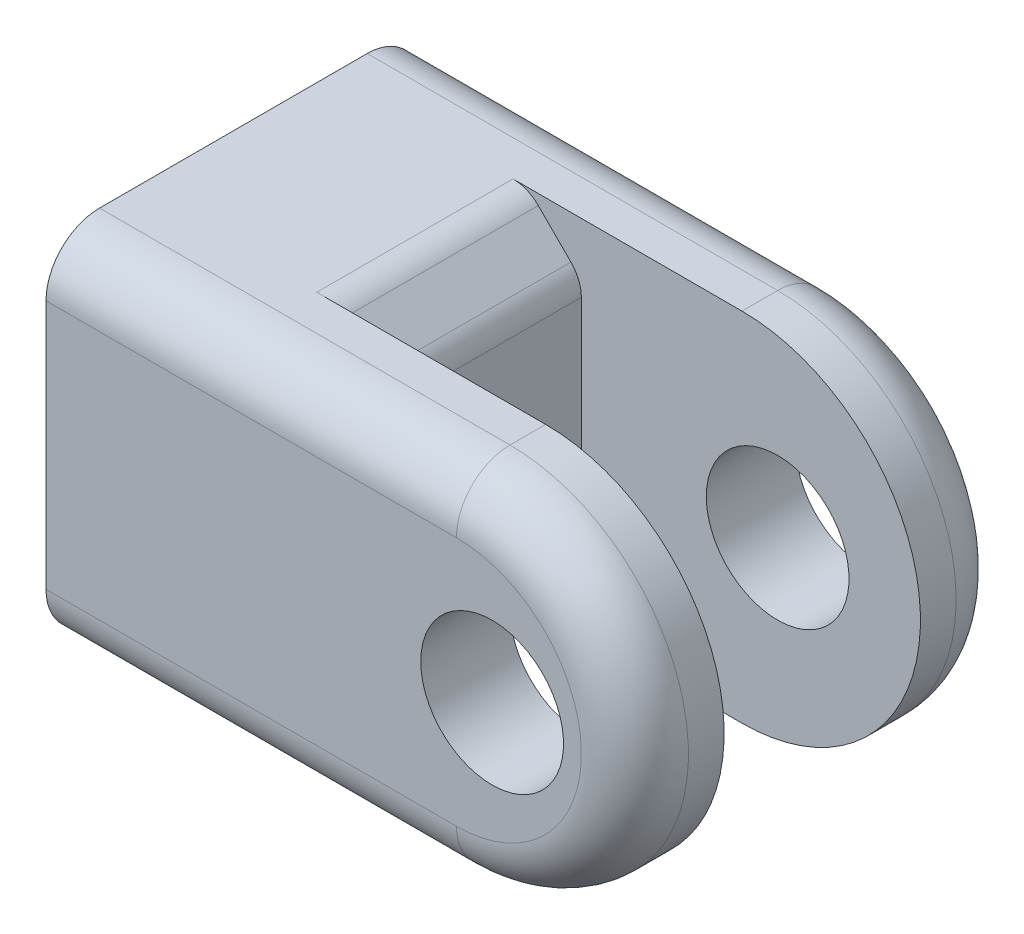
ISO-10303-21;
HEADER;
FILE_DESCRIPTION(('STEP AP214'),'2;1');
FILE_NAME('part.step','',(''),(''),'','','');
FILE_SCHEMA(('AUTOMOTIVE_DESIGN { 1 0 10303 214 1 1 1 1 }'));
ENDSEC;
DATA;
#1=APPLICATION_CONTEXT('core data for automotive mechanical design processes');
#2=APPLICATION_PROTOCOL_DEFINITION('international standard','automotive_design',2000,#1);
#3=PRODUCT_CONTEXT('',#1,'mechanical');
#4=PRODUCT('Part','Part','',(#3));
#5=PRODUCT_RELATED_PRODUCT_CATEGORY('part','',(#4));
#6=PRODUCT_DEFINITION_FORMATION('','',#4);
#7=PRODUCT_DEFINITION_CONTEXT('part definition',#1,'design');
#8=PRODUCT_DEFINITION('design','',#6,#7);
#9=PRODUCT_DEFINITION_SHAPE('','',#8);
#10=(LENGTH_UNIT() NAMED_UNIT(*) SI_UNIT(.MILLI.,.METRE.));
#11=(NAMED_UNIT(*) PLANE_ANGLE_UNIT() SI_UNIT($,.RADIAN.));
#12=(NAMED_UNIT(*) SI_UNIT($,.STERADIAN.) SOLID_ANGLE_UNIT());
#13=UNCERTAINTY_MEASURE_WITH_UNIT(LENGTH_MEASURE(1.E-05),#10,'distance_accuracy_value','');
#14=(GEOMETRIC_REPRESENTATION_CONTEXT(3) GLOBAL_UNCERTAINTY_ASSIGNED_CONTEXT((#13)) GLOBAL_UNIT_ASSIGNED_CONTEXT((#10,
#11,#12)) REPRESENTATION_CONTEXT('',''));
#15=CARTESIAN_POINT('',(0.,0.,0.));
#16=DIRECTION('',(0.,0.,1.));
#17=DIRECTION('',(1.,0.,0.));
#18=AXIS2_PLACEMENT_3D('',#15,#16,#17);
#19=CARTESIAN_POINT('',(23.,10.,21.));
#20=DIRECTION('',(0.,0.,-1.));
#21=DIRECTION('',(-1.,0.,0.));
#22=AXIS2_PLACEMENT_3D('',#19,#20,#21);
#23=CYLINDRICAL_SURFACE('',#22,9.99999999999999);
#24=DIRECTION('',(0.,0.,-1.));
#25=VECTOR('',#24,1.);
#26=CARTESIAN_POINT('',(23.,20.,21.));
#27=LINE('',#26,#25);
#28=CARTESIAN_POINT('',(23.,20.,18.));
#29=VERTEX_POINT('',#28);
#30=CARTESIAN_POINT('',(23.,20.,16.));
#31=VERTEX_POINT('',#30);
#32=EDGE_CURVE('E254',#29,#31,#27,.T.);
#33=ORIENTED_EDGE('',*,*,#32,.F.);
#34=CARTESIAN_POINT('',(23.,10.,18.));
#35=DIRECTION('',(0.,0.,-1.));
#36=DIRECTION('',(-1.,0.,0.));
#37=AXIS2_PLACEMENT_3D('',#34,#35,#36);
#38=CIRCLE('',#37,9.99999999999999);
#39=CARTESIAN_POINT('',(23.,0.,18.));
#40=VERTEX_POINT('',#39);
#41=EDGE_CURVE('E283',#29,#40,#38,.T.);
#42=ORIENTED_EDGE('',*,*,#41,.T.);
#43=DIRECTION('',(0.,0.,-1.));
#44=VECTOR('',#43,1.);
#45=CARTESIAN_POINT('',(23.,0.,21.));
#46=LINE('',#45,#44);
#47=CARTESIAN_POINT('',(23.,0.,16.));
#48=VERTEX_POINT('',#47);
#49=EDGE_CURVE('E257',#40,#48,#46,.T.);
#50=ORIENTED_EDGE('',*,*,#49,.T.);
#51=CARTESIAN_POINT('',(23.,10.,16.));
#52=DIRECTION('',(0.,0.,1.));
#53=DIRECTION('',(1.,0.,0.));
#54=AXIS2_PLACEMENT_3D('',#51,#52,#53);
#55=CIRCLE('',#54,9.99999999999999);
#56=EDGE_CURVE('E232',#48,#31,#55,.T.);
#57=ORIENTED_EDGE('',*,*,#56,.T.);
#58=EDGE_LOOP('',(#33,#42,#50,#57));
#59=FACE_BOUND('',#58,.T.);
#60=ADVANCED_FACE('F38',(#59),#23,.T.);
#61=CARTESIAN_POINT('',(25.,10.,21.));
#62=DIRECTION('',(0.,0.,-1.));
#63=DIRECTION('',(-1.,0.,0.));
#64=AXIS2_PLACEMENT_3D('',#61,#62,#63);
#65=CYLINDRICAL_SURFACE('',#64,4.);
#66=CARTESIAN_POINT('',(25.,10.,16.));
#67=DIRECTION('',(0.,0.,1.));
#68=DIRECTION('',(1.,0.,0.));
#69=AXIS2_PLACEMENT_3D('',#66,#67,#68);
#70=CIRCLE('',#69,4.);
#71=CARTESIAN_POINT('',(21.,10.,16.));
#72=VERTEX_POINT('',#71);
#73=EDGE_CURVE('E231',#72,#72,#70,.T.);
#74=CARTESIAN_POINT('',(25.,10.,21.));
#75=DIRECTION('',(0.,0.,1.));
#76=DIRECTION('',(1.,0.,0.));
#77=AXIS2_PLACEMENT_3D('',#74,#75,#76);
#78=CIRCLE('',#77,4.);
#79=CARTESIAN_POINT('',(21.,10.,21.));
#80=VERTEX_POINT('',#79);
#81=EDGE_CURVE('E236',#80,#80,#78,.T.);
#82=CARTESIAN_POINT('',(21.,10.,16.));
#83=CARTESIAN_POINT('',(21.,10.,16.0520833333333));
#84=CARTESIAN_POINT('',(21.,10.,16.1041666666667));
#85=CARTESIAN_POINT('',(21.,10.,16.2083333333333));
#86=CARTESIAN_POINT('',(21.,10.,16.2604166666667));
#87=CARTESIAN_POINT('',(21.,10.,16.3645833333333));
#88=CARTESIAN_POINT('',(21.,10.,16.4166666666667));
#89=CARTESIAN_POINT('',(21.,10.,16.5208333333333));
#90=CARTESIAN_POINT('',(21.,10.,16.5729166666667));
#91=CARTESIAN_POINT('',(21.,10.,16.6770833333333));
#92=CARTESIAN_POINT('',(21.,10.,16.7291666666667));
#93=CARTESIAN_POINT('',(21.,10.,16.8333333333333));
#94=CARTESIAN_POINT('',(21.,10.,16.8854166666667));
#95=CARTESIAN_POINT('',(21.,10.,16.9895833333333));
#96=CARTESIAN_POINT('',(21.,10.,17.0416666666667));
#97=CARTESIAN_POINT('',(21.,10.,17.1458333333333));
#98=CARTESIAN_POINT('',(21.,10.,17.1979166666667));
#99=CARTESIAN_POINT('',(21.,10.,17.3020833333333));
#100=CARTESIAN_POINT('',(21.,10.,17.3541666666667));
#101=CARTESIAN_POINT('',(21.,10.,17.4583333333333));
#102=CARTESIAN_POINT('',(21.,10.,17.5104166666667));
#103=CARTESIAN_POINT('',(21.,10.,17.6145833333333));
#104=CARTESIAN_POINT('',(21.,10.,17.6666666666667));
#105=CARTESIAN_POINT('',(21.,10.,17.7708333333333));
#106=CARTESIAN_POINT('',(21.,10.,17.8229166666667));
#107=CARTESIAN_POINT('',(21.,10.,17.9270833333333));
#108=CARTESIAN_POINT('',(21.,10.,17.9791666666667));
#109=CARTESIAN_POINT('',(21.,10.,18.0833333333333));
#110=CARTESIAN_POINT('',(21.,10.,18.1354166666667));
#111=CARTESIAN_POINT('',(21.,10.,18.2395833333333));
#112=CARTESIAN_POINT('',(21.,10.,18.2916666666667));
#113=CARTESIAN_POINT('',(21.,10.,18.3958333333333));
#114=CARTESIAN_POINT('',(21.,10.,18.4479166666667));
#115=CARTESIAN_POINT('',(21.,10.,18.5520833333333));
#116=CARTESIAN_POINT('',(21.,10.,18.6041666666667));
#117=CARTESIAN_POINT('',(21.,10.,18.7083333333333));
#118=CARTESIAN_POINT('',(21.,10.,18.7604166666667));
#119=CARTESIAN_POINT('',(21.,10.,18.8645833333333));
#120=CARTESIAN_POINT('',(21.,10.,18.9166666666667));
#121=CARTESIAN_POINT('',(21.,10.,19.0208333333333));
#122=CARTESIAN_POINT('',(21.,10.,19.0729166666667));
#123=CARTESIAN_POINT('',(21.,10.,19.1770833333333));
#124=CARTESIAN_POINT('',(21.,10.,19.2291666666667));
#125=CARTESIAN_POINT('',(21.,10.,19.3333333333333));
#126=CARTESIAN_POINT('',(21.,10.,19.3854166666667));
#127=CARTESIAN_POINT('',(21.,10.,19.4895833333333));
#128=CARTESIAN_POINT('',(21.,10.,19.5416666666667));
#129=CARTESIAN_POINT('',(21.,10.,19.6458333333333));
#130=CARTESIAN_POINT('',(21.,10.,19.6979166666667));
#131=CARTESIAN_POINT('',(21.,10.,19.8020833333333));
#132=CARTESIAN_POINT('',(21.,10.,19.8541666666667));
#133=CARTESIAN_POINT('',(21.,10.,19.9583333333333));
#134=CARTESIAN_POINT('',(21.,10.,20.0104166666667));
#135=CARTESIAN_POINT('',(21.,10.,20.1145833333333));
#136=CARTESIAN_POINT('',(21.,10.,20.1666666666667));
#137=CARTESIAN_POINT('',(21.,10.,20.2708333333333));
#138=CARTESIAN_POINT('',(21.,10.,20.3229166666667));
#139=CARTESIAN_POINT('',(21.,10.,20.4270833333333));
#140=CARTESIAN_POINT('',(21.,10.,20.4791666666667));
#141=CARTESIAN_POINT('',(21.,10.,20.5833333333333));
#142=CARTESIAN_POINT('',(21.,10.,20.6354166666667));
#143=CARTESIAN_POINT('',(21.,10.,20.7395833333333));
#144=CARTESIAN_POINT('',(21.,10.,20.7916666666667));
#145=CARTESIAN_POINT('',(21.,10.,20.8958333333333));
#146=CARTESIAN_POINT('',(21.,10.,20.9479166666667));
#147=CARTESIAN_POINT('',(21.,10.,21.));
#148=B_SPLINE_CURVE_WITH_KNOTS('',3,(#82,#83,#84,#85,#86,#87,#88,#89,#90,#91,#92,#93,#94,#95,
#96,#97,#98,#99,#100,#101,#102,#103,#104,#105,#106,#107,#108,#109,#110,#111,#112,#113,#114,#115,
#116,#117,#118,#119,#120,#121,#122,#123,#124,#125,#126,#127,#128,#129,#130,#131,#132,#133,#134,
#135,#136,#137,#138,#139,#140,#141,#142,#143,#144,#145,#146,#147),.UNSPECIFIED.,.F.,.F.,(4,2,2,
2,2,2,2,2,2,2,2,2,2,2,2,2,2,2,2,2,2,2,2,2,2,2,2,2,2,2,2,2,4),(0.,0.15625,0.3125,0.46875,
0.625000000000001,0.781250000000001,0.937500000000001,1.09375,1.25,1.40625,1.5625,1.71875,1.875,
2.03125,2.1875,2.34375,2.5,2.65625,2.8125,2.96875,3.125,3.28125,3.4375,3.59375,3.75,3.90625,
4.0625,4.21875,4.375,4.53125,4.6875,4.84375,5.),.UNSPECIFIED.);
#149=EDGE_CURVE('BSEAM448',#72,#80,#148,.T.);
#150=ORIENTED_EDGE('',*,*,#73,.F.);
#151=ORIENTED_EDGE('',*,*,#81,.T.);
#152=ORIENTED_EDGE('',*,*,#149,.T.);
#153=ORIENTED_EDGE('',*,*,#149,.F.);
#154=EDGE_LOOP('',(#150,#152,#151,#153));
#155=FACE_BOUND('',#154,.T.);
#156=ADVANCED_FACE('F448',(#155),#65,.F.);
#157=CARTESIAN_POINT('',(23.,10.,21.));
#158=DIRECTION('',(0.,0.,-1.));
#159=DIRECTION('',(-1.,0.,0.));
#160=AXIS2_PLACEMENT_3D('',#157,#158,#159);
#161=PLANE('',#160);
#162=CARTESIAN_POINT('',(23.,10.,21.));
#163=DIRECTION('',(0.,0.,-1.));
#164=DIRECTION('',(-1.,0.,0.));
#165=AXIS2_PLACEMENT_3D('',#162,#163,#164);
#166=CIRCLE('',#165,6.99999999999999);
#167=CARTESIAN_POINT('',(23.,3.,21.));
#168=VERTEX_POINT('',#167);
#169=CARTESIAN_POINT('',(23.,17.,21.));
#170=VERTEX_POINT('',#169);
#171=EDGE_CURVE('E265',#168,#170,#166,.F.);
#172=ORIENTED_EDGE('',*,*,#171,.T.);
#173=DIRECTION('',(-1.,0.,0.));
#174=VECTOR('',#173,1.);
#175=CARTESIAN_POINT('',(23.,17.,21.));
#176=LINE('',#175,#174);
#177=CARTESIAN_POINT('',(0.,17.,21.));
#178=VERTEX_POINT('',#177);
#179=EDGE_CURVE('E267',#170,#178,#176,.T.);
#180=ORIENTED_EDGE('',*,*,#179,.T.);
#181=DIRECTION('',(0.,-1.,0.));
#182=VECTOR('',#181,1.);
#183=CARTESIAN_POINT('',(0.,0.,21.));
#184=LINE('',#183,#182);
#185=CARTESIAN_POINT('',(0.,3.,21.));
#186=VERTEX_POINT('',#185);
#187=EDGE_CURVE('E242',#178,#186,#184,.T.);
#188=ORIENTED_EDGE('',*,*,#187,.T.);
#189=DIRECTION('',(1.,0.,0.));
#190=VECTOR('',#189,1.);
#191=CARTESIAN_POINT('',(23.,3.,21.));
#192=LINE('',#191,#190);
#193=EDGE_CURVE('E259',#186,#168,#192,.T.);
#194=ORIENTED_EDGE('',*,*,#193,.T.);
#195=EDGE_LOOP('',(#172,#180,#188,#194));
#196=FACE_BOUND('',#195,.T.);
#197=ORIENTED_EDGE('',*,*,#81,.F.);
#198=EDGE_LOOP('',(#197));
#199=FACE_BOUND('',#198,.T.);
#200=ADVANCED_FACE('F409',(#196,#199),#161,.F.);
#201=CARTESIAN_POINT('',(23.,10.,0.));
#202=DIRECTION('',(0.,0.,-1.));
#203=DIRECTION('',(-1.,0.,0.));
#204=AXIS2_PLACEMENT_3D('',#201,#202,#203);
#205=PLANE('',#204);
#206=DIRECTION('',(0.,-1.,0.));
#207=VECTOR('',#206,1.);
#208=CARTESIAN_POINT('',(0.,0.,0.));
#209=LINE('',#208,#207);
#210=CARTESIAN_POINT('',(0.,17.,0.));
#211=VERTEX_POINT('',#210);
#212=CARTESIAN_POINT('',(0.,3.,0.));
#213=VERTEX_POINT('',#212);
#214=EDGE_CURVE('E239',#211,#213,#209,.T.);
#215=ORIENTED_EDGE('',*,*,#214,.F.);
#216=DIRECTION('',(-1.,0.,0.));
#217=VECTOR('',#216,1.);
#218=CARTESIAN_POINT('',(23.,17.,0.));
#219=LINE('',#218,#217);
#220=CARTESIAN_POINT('',(23.,17.,0.));
#221=VERTEX_POINT('',#220);
#222=EDGE_CURVE('E289',#211,#221,#219,.F.);
#223=ORIENTED_EDGE('',*,*,#222,.T.);
#224=CARTESIAN_POINT('',(23.,10.,0.));
#225=DIRECTION('',(0.,0.,-1.));
#226=DIRECTION('',(-1.,0.,0.));
#227=AXIS2_PLACEMENT_3D('',#224,#225,#226);
#228=CIRCLE('',#227,6.99999999999999);
#229=CARTESIAN_POINT('',(23.,3.,0.));
#230=VERTEX_POINT('',#229);
#231=EDGE_CURVE('E287',#221,#230,#228,.T.);
#232=ORIENTED_EDGE('',*,*,#231,.T.);
#233=DIRECTION('',(1.,0.,0.));
#234=VECTOR('',#233,1.);
#235=CARTESIAN_POINT('',(0.,3.,0.));
#236=LINE('',#235,#234);
#237=EDGE_CURVE('E285',#230,#213,#236,.F.);
#238=ORIENTED_EDGE('',*,*,#237,.T.);
#239=EDGE_LOOP('',(#215,#223,#232,#238));
#240=FACE_BOUND('',#239,.T.);
#241=CARTESIAN_POINT('',(25.,10.,0.));
#242=DIRECTION('',(0.,0.,1.));
#243=DIRECTION('',(1.,0.,0.));
#244=AXIS2_PLACEMENT_3D('',#241,#242,#243);
#245=CIRCLE('',#244,4.);
#246=CARTESIAN_POINT('',(21.,10.,0.));
#247=VERTEX_POINT('',#246);
#248=EDGE_CURVE('E235',#247,#247,#245,.T.);
#249=ORIENTED_EDGE('',*,*,#248,.T.);
#250=EDGE_LOOP('',(#249));
#251=FACE_BOUND('',#250,.T.);
#252=ADVANCED_FACE('F435',(#240,#251),#205,.T.);
#253=CARTESIAN_POINT('',(0.,0.,21.));
#254=DIRECTION('',(0.,1.,0.));
#255=DIRECTION('',(0.,0.,1.));
#256=AXIS2_PLACEMENT_3D('',#253,#254,#255);
#257=PLANE('',#256);
#258=DIRECTION('',(0.,0.,-1.));
#259=VECTOR('',#258,1.);
#260=CARTESIAN_POINT('',(10.1715728752538,0.,16.));
#261=LINE('',#260,#259);
#262=CARTESIAN_POINT('',(10.1715728752538,0.,5.));
#263=VERTEX_POINT('',#262);
#264=CARTESIAN_POINT('',(10.1715728752538,0.,16.));
#265=VERTEX_POINT('',#264);
#266=EDGE_CURVE('E337',#263,#265,#261,.F.);
#267=ORIENTED_EDGE('',*,*,#266,.T.);
#268=DIRECTION('',(-1.,0.,0.));
#269=VECTOR('',#268,1.);
#270=CARTESIAN_POINT('',(14.,0.,16.));
#271=LINE('',#270,#269);
#272=EDGE_CURVE('E53',#48,#265,#271,.T.);
#273=ORIENTED_EDGE('',*,*,#272,.F.);
#274=ORIENTED_EDGE('',*,*,#49,.F.);
#275=DIRECTION('',(1.,0.,0.));
#276=VECTOR('',#275,1.);
#277=CARTESIAN_POINT('',(0.,0.,18.));
#278=LINE('',#277,#276);
#279=CARTESIAN_POINT('',(0.,0.,18.));
#280=VERTEX_POINT('',#279);
#281=EDGE_CURVE('E295',#40,#280,#278,.F.);
#282=ORIENTED_EDGE('',*,*,#281,.T.);
#283=DIRECTION('',(0.,0.,-1.));
#284=VECTOR('',#283,1.);
#285=CARTESIAN_POINT('',(0.,0.,21.));
#286=LINE('',#285,#284);
#287=CARTESIAN_POINT('',(0.,0.,3.00000000000001));
#288=VERTEX_POINT('',#287);
#289=EDGE_CURVE('E245',#280,#288,#286,.T.);
#290=ORIENTED_EDGE('',*,*,#289,.T.);
#291=DIRECTION('',(1.,0.,0.));
#292=VECTOR('',#291,1.);
#293=CARTESIAN_POINT('',(23.,0.,3.));
#294=LINE('',#293,#292);
#295=CARTESIAN_POINT('',(23.,0.,3.00000000000001));
#296=VERTEX_POINT('',#295);
#297=EDGE_CURVE('E293',#288,#296,#294,.T.);
#298=ORIENTED_EDGE('',*,*,#297,.T.);
#299=CARTESIAN_POINT('',(23.,0.,5.));
#300=VERTEX_POINT('',#299);
#301=EDGE_CURVE('E256',#300,#296,#46,.T.);
#302=ORIENTED_EDGE('',*,*,#301,.F.);
#303=DIRECTION('',(1.,0.,0.));
#304=VECTOR('',#303,1.);
#305=CARTESIAN_POINT('',(14.,0.,5.));
#306=LINE('',#305,#304);
#307=EDGE_CURVE('E61',#263,#300,#306,.T.);
#308=ORIENTED_EDGE('',*,*,#307,.F.);
#309=EDGE_LOOP('',(#267,#273,#274,#282,#290,#298,#302,#308));
#310=FACE_BOUND('',#309,.T.);
#311=ADVANCED_FACE('F396',(#310),#257,.F.);
#312=ORIENTED_EDGE('',*,*,#301,.T.);
#313=CARTESIAN_POINT('',(23.,10.,3.));
#314=DIRECTION('',(0.,0.,-1.));
#315=DIRECTION('',(-1.,0.,0.));
#316=AXIS2_PLACEMENT_3D('',#313,#314,#315);
#317=CIRCLE('',#316,9.99999999999999);
#318=CARTESIAN_POINT('',(23.,20.,3.));
#319=VERTEX_POINT('',#318);
#320=EDGE_CURVE('E291',#296,#319,#317,.F.);
#321=ORIENTED_EDGE('',*,*,#320,.T.);
#322=CARTESIAN_POINT('',(23.,20.,5.00000000000001));
#323=VERTEX_POINT('',#322);
#324=EDGE_CURVE('E253',#323,#319,#27,.T.);
#325=ORIENTED_EDGE('',*,*,#324,.F.);
#326=CARTESIAN_POINT('',(23.,10.,5.));
#327=DIRECTION('',(0.,0.,-1.));
#328=DIRECTION('',(-1.,0.,0.));
#329=AXIS2_PLACEMENT_3D('',#326,#327,#328);
#330=CIRCLE('',#329,9.99999999999999);
#331=EDGE_CURVE('E229',#323,#300,#330,.T.);
#332=ORIENTED_EDGE('',*,*,#331,.T.);
#333=EDGE_LOOP('',(#312,#321,#325,#332));
#334=FACE_BOUND('',#333,.T.);
#335=ADVANCED_FACE('F430',(#334),#23,.T.);
#336=CARTESIAN_POINT('',(0.,20.,21.));
#337=DIRECTION('',(0.,-1.,0.));
#338=DIRECTION('',(1.,0.,0.));
#339=AXIS2_PLACEMENT_3D('',#336,#337,#338);
#340=PLANE('',#339);
#341=DIRECTION('',(0.,0.,1.));
#342=VECTOR('',#341,1.);
#343=CARTESIAN_POINT('',(10.1715728752538,20.,5.));
#344=LINE('',#343,#342);
#345=CARTESIAN_POINT('',(10.1715728752538,20.,16.));
#346=VERTEX_POINT('',#345);
#347=CARTESIAN_POINT('',(10.1715728752538,20.,5.));
#348=VERTEX_POINT('',#347);
#349=EDGE_CURVE('E320',#346,#348,#344,.F.);
#350=ORIENTED_EDGE('',*,*,#349,.T.);
#351=DIRECTION('',(-1.,0.,0.));
#352=VECTOR('',#351,1.);
#353=CARTESIAN_POINT('',(14.,20.,5.));
#354=LINE('',#353,#352);
#355=EDGE_CURVE('E215',#323,#348,#354,.T.);
#356=ORIENTED_EDGE('',*,*,#355,.F.);
#357=ORIENTED_EDGE('',*,*,#324,.T.);
#358=DIRECTION('',(-1.,0.,0.));
#359=VECTOR('',#358,1.);
#360=CARTESIAN_POINT('',(0.,20.,3.));
#361=LINE('',#360,#359);
#362=CARTESIAN_POINT('',(0.,20.,3.00000000000001));
#363=VERTEX_POINT('',#362);
#364=EDGE_CURVE('E278',#319,#363,#361,.T.);
#365=ORIENTED_EDGE('',*,*,#364,.T.);
#366=DIRECTION('',(0.,0.,-1.));
#367=VECTOR('',#366,1.);
#368=CARTESIAN_POINT('',(0.,20.,21.));
#369=LINE('',#368,#367);
#370=CARTESIAN_POINT('',(0.,20.,18.));
#371=VERTEX_POINT('',#370);
#372=EDGE_CURVE('E250',#371,#363,#369,.T.);
#373=ORIENTED_EDGE('',*,*,#372,.F.);
#374=DIRECTION('',(-1.,0.,0.));
#375=VECTOR('',#374,1.);
#376=CARTESIAN_POINT('',(0.,20.,18.));
#377=LINE('',#376,#375);
#378=EDGE_CURVE('E281',#371,#29,#377,.F.);
#379=ORIENTED_EDGE('',*,*,#378,.T.);
#380=ORIENTED_EDGE('',*,*,#32,.T.);
#381=DIRECTION('',(1.,0.,0.));
#382=VECTOR('',#381,1.);
#383=CARTESIAN_POINT('',(14.,20.,16.));
#384=LINE('',#383,#382);
#385=EDGE_CURVE('E219',#346,#31,#384,.T.);
#386=ORIENTED_EDGE('',*,*,#385,.F.);
#387=EDGE_LOOP('',(#350,#356,#357,#365,#373,#379,#380,#386));
#388=FACE_BOUND('',#387,.T.);
#389=ADVANCED_FACE('F387',(#388),#340,.F.);
#390=CARTESIAN_POINT('',(0.,0.,21.));
#391=DIRECTION('',(1.,0.,0.));
#392=DIRECTION('',(0.,1.,0.));
#393=AXIS2_PLACEMENT_3D('',#390,#391,#392);
#394=PLANE('',#393);
#395=CARTESIAN_POINT('',(0.,17.5,2.));
#396=DIRECTION('',(-1.,0.,0.));
#397=DIRECTION('',(0.,0.,1.));
#398=AXIS2_PLACEMENT_3D('',#395,#396,#397);
#399=CIRCLE('',#398,0.799999999999999);
#400=CARTESIAN_POINT('',(0.,17.5,2.8));
#401=VERTEX_POINT('',#400);
#402=EDGE_CURVE('E186',#401,#401,#399,.T.);
#403=ORIENTED_EDGE('',*,*,#402,.F.);
#404=EDGE_LOOP('',(#403));
#405=FACE_BOUND('',#404,.T.);
#406=CARTESIAN_POINT('',(0.,17.5,19.));
#407=DIRECTION('',(-1.,0.,0.));
#408=DIRECTION('',(0.,0.,1.));
#409=AXIS2_PLACEMENT_3D('',#406,#407,#408);
#410=CIRCLE('',#409,0.799999999999999);
#411=CARTESIAN_POINT('',(0.,17.5,19.8));
#412=VERTEX_POINT('',#411);
#413=EDGE_CURVE('E185',#412,#412,#410,.T.);
#414=ORIENTED_EDGE('',*,*,#413,.F.);
#415=EDGE_LOOP('',(#414));
#416=FACE_BOUND('',#415,.T.);
#417=CARTESIAN_POINT('',(0.,2.49999999999999,19.));
#418=DIRECTION('',(-1.,0.,0.));
#419=DIRECTION('',(0.,0.,1.));
#420=AXIS2_PLACEMENT_3D('',#417,#418,#419);
#421=CIRCLE('',#420,0.799999999999999);
#422=CARTESIAN_POINT('',(0.,2.49999999999999,19.8));
#423=VERTEX_POINT('',#422);
#424=EDGE_CURVE('E197',#423,#423,#421,.T.);
#425=ORIENTED_EDGE('',*,*,#424,.F.);
#426=EDGE_LOOP('',(#425));
#427=FACE_BOUND('',#426,.T.);
#428=CARTESIAN_POINT('',(0.,2.49999999999999,2.));
#429=DIRECTION('',(-1.,0.,0.));
#430=DIRECTION('',(0.,0.,1.));
#431=AXIS2_PLACEMENT_3D('',#428,#429,#430);
#432=CIRCLE('',#431,0.799999999999999);
#433=CARTESIAN_POINT('',(0.,2.49999999999999,2.8));
#434=VERTEX_POINT('',#433);
#435=EDGE_CURVE('E203',#434,#434,#432,.T.);
#436=ORIENTED_EDGE('',*,*,#435,.F.);
#437=EDGE_LOOP('',(#436));
#438=FACE_BOUND('',#437,.T.);
#439=CARTESIAN_POINT('',(0.,9.99999999999999,10.5));
#440=DIRECTION('',(-1.,0.,0.));
#441=DIRECTION('',(0.,-1.,0.));
#442=AXIS2_PLACEMENT_3D('',#439,#440,#441);
#443=CIRCLE('',#442,8.5);
#444=CARTESIAN_POINT('',(0.,1.49999999999999,10.5));
#445=VERTEX_POINT('',#444);
#446=EDGE_CURVE('E209',#445,#445,#443,.T.);
#447=ORIENTED_EDGE('',*,*,#446,.F.);
#448=EDGE_LOOP('',(#447));
#449=FACE_BOUND('',#448,.T.);
#450=ORIENTED_EDGE('',*,*,#187,.F.);
#451=CARTESIAN_POINT('',(0.,17.,18.));
#452=DIRECTION('',(1.,0.,0.));
#453=DIRECTION('',(0.,1.,0.));
#454=AXIS2_PLACEMENT_3D('',#451,#452,#453);
#455=CIRCLE('',#454,3.);
#456=EDGE_CURVE('E276',#178,#371,#455,.F.);
#457=ORIENTED_EDGE('',*,*,#456,.T.);
#458=ORIENTED_EDGE('',*,*,#372,.T.);
#459=CARTESIAN_POINT('',(0.,17.,3.));
#460=DIRECTION('',(1.,0.,0.));
#461=DIRECTION('',(0.,1.,0.));
#462=AXIS2_PLACEMENT_3D('',#459,#460,#461);
#463=CIRCLE('',#462,3.);
#464=EDGE_CURVE('E274',#363,#211,#463,.F.);
#465=ORIENTED_EDGE('',*,*,#464,.T.);
#466=ORIENTED_EDGE('',*,*,#214,.T.);
#467=CARTESIAN_POINT('',(0.,3.,3.));
#468=DIRECTION('',(1.,0.,0.));
#469=DIRECTION('',(0.,1.,0.));
#470=AXIS2_PLACEMENT_3D('',#467,#468,#469);
#471=CIRCLE('',#470,3.);
#472=EDGE_CURVE('E270',#213,#288,#471,.F.);
#473=ORIENTED_EDGE('',*,*,#472,.T.);
#474=ORIENTED_EDGE('',*,*,#289,.F.);
#475=CARTESIAN_POINT('',(0.,3.,18.));
#476=DIRECTION('',(1.,0.,0.));
#477=DIRECTION('',(0.,1.,0.));
#478=AXIS2_PLACEMENT_3D('',#475,#476,#477);
#479=CIRCLE('',#478,3.);
#480=EDGE_CURVE('E272',#280,#186,#479,.F.);
#481=ORIENTED_EDGE('',*,*,#480,.T.);
#482=EDGE_LOOP('',(#450,#457,#458,#465,#466,#473,#474,#481));
#483=FACE_BOUND('',#482,.T.);
#484=ADVANCED_FACE('F413',(#405,#416,#427,#438,#449,#483),#394,.F.);
#485=CARTESIAN_POINT('',(25.,10.,5.));
#486=DIRECTION('',(0.,0.,-1.));
#487=DIRECTION('',(-1.,0.,0.));
#488=AXIS2_PLACEMENT_3D('',#485,#486,#487);
#489=CIRCLE('',#488,4.);
#490=CARTESIAN_POINT('',(21.,10.,5.));
#491=VERTEX_POINT('',#490);
#492=EDGE_CURVE('E228',#491,#491,#489,.T.);
#493=CARTESIAN_POINT('',(21.,10.,5.));
#494=CARTESIAN_POINT('',(21.,10.,4.94791666666667));
#495=CARTESIAN_POINT('',(21.,10.,4.89583333333334));
#496=CARTESIAN_POINT('',(21.,10.,4.79166666666667));
#497=CARTESIAN_POINT('',(21.,10.,4.73958333333334));
#498=CARTESIAN_POINT('',(21.,10.,4.63541666666667));
#499=CARTESIAN_POINT('',(21.,10.,4.58333333333334));
#500=CARTESIAN_POINT('',(21.,10.,4.47916666666667));
#501=CARTESIAN_POINT('',(21.,10.,4.42708333333334));
#502=CARTESIAN_POINT('',(21.,10.,4.32291666666667));
#503=CARTESIAN_POINT('',(21.,10.,4.27083333333334));
#504=CARTESIAN_POINT('',(21.,10.,4.16666666666667));
#505=CARTESIAN_POINT('',(21.,10.,4.11458333333334));
#506=CARTESIAN_POINT('',(21.,10.,4.01041666666667));
#507=CARTESIAN_POINT('',(21.,10.,3.95833333333334));
#508=CARTESIAN_POINT('',(21.,10.,3.85416666666667));
#509=CARTESIAN_POINT('',(21.,10.,3.80208333333334));
#510=CARTESIAN_POINT('',(21.,10.,3.69791666666667));
#511=CARTESIAN_POINT('',(21.,10.,3.64583333333334));
#512=CARTESIAN_POINT('',(21.,10.,3.54166666666667));
#513=CARTESIAN_POINT('',(21.,10.,3.48958333333334));
#514=CARTESIAN_POINT('',(21.,10.,3.38541666666667));
#515=CARTESIAN_POINT('',(21.,10.,3.33333333333334));
#516=CARTESIAN_POINT('',(21.,10.,3.22916666666667));
#517=CARTESIAN_POINT('',(21.,10.,3.17708333333334));
#518=CARTESIAN_POINT('',(21.,10.,3.07291666666667));
#519=CARTESIAN_POINT('',(21.,10.,3.02083333333334));
#520=CARTESIAN_POINT('',(21.,10.,2.91666666666667));
#521=CARTESIAN_POINT('',(21.,10.,2.86458333333334));
#522=CARTESIAN_POINT('',(21.,10.,2.76041666666667));
#523=CARTESIAN_POINT('',(21.,10.,2.70833333333334));
#524=CARTESIAN_POINT('',(21.,10.,2.60416666666667));
#525=CARTESIAN_POINT('',(21.,10.,2.55208333333334));
#526=CARTESIAN_POINT('',(21.,10.,2.44791666666667));
#527=CARTESIAN_POINT('',(21.,10.,2.39583333333334));
#528=CARTESIAN_POINT('',(21.,10.,2.29166666666667));
#529=CARTESIAN_POINT('',(21.,10.,2.23958333333334));
#530=CARTESIAN_POINT('',(21.,10.,2.13541666666667));
#531=CARTESIAN_POINT('',(21.,10.,2.08333333333334));
#532=CARTESIAN_POINT('',(21.,10.,1.97916666666667));
#533=CARTESIAN_POINT('',(21.,10.,1.92708333333334));
#534=CARTESIAN_POINT('',(21.,10.,1.82291666666667));
#535=CARTESIAN_POINT('',(21.,10.,1.77083333333334));
#536=CARTESIAN_POINT('',(21.,10.,1.66666666666667));
#537=CARTESIAN_POINT('',(21.,10.,1.61458333333333));
#538=CARTESIAN_POINT('',(21.,10.,1.51041666666667));
#539=CARTESIAN_POINT('',(21.,10.,1.45833333333333));
#540=CARTESIAN_POINT('',(21.,10.,1.35416666666667));
#541=CARTESIAN_POINT('',(21.,10.,1.30208333333333));
#542=CARTESIAN_POINT('',(21.,10.,1.19791666666667));
#543=CARTESIAN_POINT('',(21.,10.,1.14583333333333));
#544=CARTESIAN_POINT('',(21.,10.,1.04166666666667));
#545=CARTESIAN_POINT('',(21.,10.,0.989583333333334));
#546=CARTESIAN_POINT('',(21.,10.,0.885416666666668));
#547=CARTESIAN_POINT('',(21.,10.,0.833333333333334));
#548=CARTESIAN_POINT('',(21.,10.,0.729166666666667));
#549=CARTESIAN_POINT('',(21.,10.,0.677083333333334));
#550=CARTESIAN_POINT('',(21.,10.,0.572916666666667));
#551=CARTESIAN_POINT('',(21.,10.,0.520833333333334));
#552=CARTESIAN_POINT('',(21.,10.,0.416666666666667));
#553=CARTESIAN_POINT('',(21.,10.,0.364583333333334));
#554=CARTESIAN_POINT('',(21.,10.,0.260416666666667));
#555=CARTESIAN_POINT('',(21.,10.,0.208333333333333));
#556=CARTESIAN_POINT('',(21.,10.,0.104166666666667));
#557=CARTESIAN_POINT('',(21.,10.,0.0520833333333334));
#558=CARTESIAN_POINT('',(21.,10.,0.));
#559=B_SPLINE_CURVE_WITH_KNOTS('',3,(#493,#494,#495,#496,#497,#498,#499,#500,#501,#502,#503,
#504,#505,#506,#507,#508,#509,#510,#511,#512,#513,#514,#515,#516,#517,#518,#519,#520,#521,#522,
#523,#524,#525,#526,#527,#528,#529,#530,#531,#532,#533,#534,#535,#536,#537,#538,#539,#540,#541,
#542,#543,#544,#545,#546,#547,#548,#549,#550,#551,#552,#553,#554,#555,#556,#557,#558),
.UNSPECIFIED.,.F.,.F.,(4,2,2,2,2,2,2,2,2,2,2,2,2,2,2,2,2,2,2,2,2,2,2,2,2,2,2,2,2,2,2,2,4),(0.,
0.15625,0.3125,0.46875,0.625000000000001,0.781250000000001,0.937500000000001,1.09375,1.25,
1.40625,1.5625,1.71875,1.875,2.03125,2.1875,2.34375,2.5,2.65625,2.8125,2.96875,3.125,3.28125,
3.4375,3.59375,3.75,3.90625,4.0625,4.21875,4.375,4.53125,4.6875,4.84375,5.),.UNSPECIFIED.);
#560=EDGE_CURVE('BSEAM455',#491,#247,#559,.T.);
#561=ORIENTED_EDGE('',*,*,#492,.F.);
#562=ORIENTED_EDGE('',*,*,#248,.F.);
#563=ORIENTED_EDGE('',*,*,#560,.T.);
#564=ORIENTED_EDGE('',*,*,#560,.F.);
#565=EDGE_LOOP('',(#561,#563,#562,#564));
#566=FACE_BOUND('',#565,.T.);
#567=ADVANCED_FACE('F455',(#566),#65,.F.);
#568=CARTESIAN_POINT('',(14.,-21.9544984001001,16.));
#569=DIRECTION('',(0.,0.,1.));
#570=DIRECTION('',(1.,0.,0.));
#571=AXIS2_PLACEMENT_3D('',#568,#569,#570);
#572=PLANE('',#571);
#573=ORIENTED_EDGE('',*,*,#73,.T.);
#574=EDGE_LOOP('',(#573));
#575=FACE_BOUND('',#574,.T.);
#576=ORIENTED_EDGE('',*,*,#56,.F.);
#577=ORIENTED_EDGE('',*,*,#272,.T.);
#578=CARTESIAN_POINT('',(10.1715728752538,2.,16.));
#579=DIRECTION('',(0.,0.,1.));
#580=DIRECTION('',(1.,0.,0.));
#581=AXIS2_PLACEMENT_3D('',#578,#579,#580);
#582=CIRCLE('',#581,2.);
#583=CARTESIAN_POINT('',(11.5857864376269,0.5857864376269,16.));
#584=VERTEX_POINT('',#583);
#585=EDGE_CURVE('E46',#265,#584,#582,.T.);
#586=ORIENTED_EDGE('',*,*,#585,.T.);
#587=DIRECTION('',(-0.707106781186549,-0.707106781186546,0.));
#588=VECTOR('',#587,1.);
#589=CARTESIAN_POINT('',(1.52275079994995,-9.47724920005,16.));
#590=LINE('',#589,#588);
#591=CARTESIAN_POINT('',(13.4142135623731,2.41421356237309,16.));
#592=VERTEX_POINT('',#591);
#593=EDGE_CURVE('E311',#584,#592,#590,.F.);
#594=ORIENTED_EDGE('',*,*,#593,.T.);
#595=CARTESIAN_POINT('',(12.,3.82842712474619,16.));
#596=DIRECTION('',(0.,0.,1.));
#597=DIRECTION('',(1.,0.,0.));
#598=AXIS2_PLACEMENT_3D('',#595,#596,#597);
#599=CIRCLE('',#598,2.);
#600=CARTESIAN_POINT('',(14.,3.82842712474619,16.));
#601=VERTEX_POINT('',#600);
#602=EDGE_CURVE('E350',#592,#601,#599,.T.);
#603=ORIENTED_EDGE('',*,*,#602,.T.);
#604=DIRECTION('',(0.,1.,0.));
#605=VECTOR('',#604,1.);
#606=CARTESIAN_POINT('',(14.,-21.9544984001001,16.));
#607=LINE('',#606,#605);
#608=CARTESIAN_POINT('',(14.,16.1715728752538,16.));
#609=VERTEX_POINT('',#608);
#610=EDGE_CURVE('E217',#601,#609,#607,.T.);
#611=ORIENTED_EDGE('',*,*,#610,.T.);
#612=CARTESIAN_POINT('',(12.,16.1715728752538,16.));
#613=DIRECTION('',(0.,0.,1.));
#614=DIRECTION('',(1.,0.,0.));
#615=AXIS2_PLACEMENT_3D('',#612,#613,#614);
#616=CIRCLE('',#615,2.);
#617=CARTESIAN_POINT('',(13.4142135623731,17.5857864376269,16.));
#618=VERTEX_POINT('',#617);
#619=EDGE_CURVE('E344',#609,#618,#616,.T.);
#620=ORIENTED_EDGE('',*,*,#619,.T.);
#621=DIRECTION('',(0.707106781186549,-0.707106781186546,0.));
#622=VECTOR('',#621,1.);
#623=CARTESIAN_POINT('',(33.4772492000501,-2.47724920004998,16.));
#624=LINE('',#623,#622);
#625=CARTESIAN_POINT('',(11.5857864376269,19.4142135623731,16.));
#626=VERTEX_POINT('',#625);
#627=EDGE_CURVE('E314',#618,#626,#624,.F.);
#628=ORIENTED_EDGE('',*,*,#627,.T.);
#629=CARTESIAN_POINT('',(10.1715728752538,18.,16.));
#630=DIRECTION('',(0.,0.,1.));
#631=DIRECTION('',(1.,0.,0.));
#632=AXIS2_PLACEMENT_3D('',#629,#630,#631);
#633=CIRCLE('',#632,2.);
#634=EDGE_CURVE('E341',#626,#346,#633,.T.);
#635=ORIENTED_EDGE('',*,*,#634,.T.);
#636=ORIENTED_EDGE('',*,*,#385,.T.);
#637=EDGE_LOOP('',(#576,#577,#586,#594,#603,#611,#620,#628,#635,#636));
#638=FACE_BOUND('',#637,.T.);
#639=ADVANCED_FACE('F352',(#575,#638),#572,.F.);
#640=CARTESIAN_POINT('',(14.,-21.9544984001001,5.));
#641=DIRECTION('',(0.,0.,-1.));
#642=DIRECTION('',(-1.,0.,0.));
#643=AXIS2_PLACEMENT_3D('',#640,#641,#642);
#644=PLANE('',#643);
#645=ORIENTED_EDGE('',*,*,#492,.T.);
#646=EDGE_LOOP('',(#645));
#647=FACE_BOUND('',#646,.T.);
#648=ORIENTED_EDGE('',*,*,#355,.T.);
#649=CARTESIAN_POINT('',(10.1715728752538,18.,5.));
#650=DIRECTION('',(0.,0.,-1.));
#651=DIRECTION('',(-1.,0.,0.));
#652=AXIS2_PLACEMENT_3D('',#649,#650,#651);
#653=CIRCLE('',#652,2.);
#654=CARTESIAN_POINT('',(11.5857864376269,19.4142135623731,5.));
#655=VERTEX_POINT('',#654);
#656=EDGE_CURVE('E339',#348,#655,#653,.T.);
#657=ORIENTED_EDGE('',*,*,#656,.T.);
#658=DIRECTION('',(-0.707106781186549,0.707106781186546,0.));
#659=VECTOR('',#658,1.);
#660=CARTESIAN_POINT('',(33.4772492000501,-2.47724920004998,5.));
#661=LINE('',#660,#659);
#662=CARTESIAN_POINT('',(13.4142135623731,17.5857864376269,5.));
#663=VERTEX_POINT('',#662);
#664=EDGE_CURVE('E317',#655,#663,#661,.F.);
#665=ORIENTED_EDGE('',*,*,#664,.T.);
#666=CARTESIAN_POINT('',(12.,16.1715728752538,5.));
#667=DIRECTION('',(0.,0.,-1.));
#668=DIRECTION('',(-1.,0.,0.));
#669=AXIS2_PLACEMENT_3D('',#666,#667,#668);
#670=CIRCLE('',#669,2.);
#671=CARTESIAN_POINT('',(14.,16.1715728752538,5.));
#672=VERTEX_POINT('',#671);
#673=EDGE_CURVE('E346',#663,#672,#670,.T.);
#674=ORIENTED_EDGE('',*,*,#673,.T.);
#675=DIRECTION('',(0.,1.,0.));
#676=VECTOR('',#675,1.);
#677=CARTESIAN_POINT('',(14.,-21.9544984001001,5.));
#678=LINE('',#677,#676);
#679=CARTESIAN_POINT('',(14.,3.82842712474619,5.));
#680=VERTEX_POINT('',#679);
#681=EDGE_CURVE('E222',#680,#672,#678,.T.);
#682=ORIENTED_EDGE('',*,*,#681,.F.);
#683=CARTESIAN_POINT('',(12.,3.82842712474619,5.));
#684=DIRECTION('',(0.,0.,-1.));
#685=DIRECTION('',(-1.,0.,0.));
#686=AXIS2_PLACEMENT_3D('',#683,#684,#685);
#687=CIRCLE('',#686,2.);
#688=CARTESIAN_POINT('',(13.4142135623731,2.41421356237309,5.));
#689=VERTEX_POINT('',#688);
#690=EDGE_CURVE('E348',#680,#689,#687,.T.);
#691=ORIENTED_EDGE('',*,*,#690,.T.);
#692=DIRECTION('',(0.707106781186549,0.707106781186546,0.));
#693=VECTOR('',#692,1.);
#694=CARTESIAN_POINT('',(1.52275079994995,-9.47724920005,5.));
#695=LINE('',#694,#693);
#696=CARTESIAN_POINT('',(11.5857864376269,0.5857864376269,5.));
#697=VERTEX_POINT('',#696);
#698=EDGE_CURVE('E297',#689,#697,#695,.F.);
#699=ORIENTED_EDGE('',*,*,#698,.T.);
#700=CARTESIAN_POINT('',(10.1715728752538,2.,5.));
#701=DIRECTION('',(0.,0.,-1.));
#702=DIRECTION('',(-1.,0.,0.));
#703=AXIS2_PLACEMENT_3D('',#700,#701,#702);
#704=CIRCLE('',#703,2.);
#705=EDGE_CURVE('E12',#697,#263,#704,.T.);
#706=ORIENTED_EDGE('',*,*,#705,.T.);
#707=ORIENTED_EDGE('',*,*,#307,.T.);
#708=ORIENTED_EDGE('',*,*,#331,.F.);
#709=EDGE_LOOP('',(#648,#657,#665,#674,#682,#691,#699,#706,#707,#708));
#710=FACE_BOUND('',#709,.T.);
#711=ADVANCED_FACE('F363',(#647,#710),#644,.F.);
#712=CARTESIAN_POINT('',(14.,-21.9544984001001,16.));
#713=DIRECTION('',(-1.,0.,0.));
#714=DIRECTION('',(0.,-1.,0.));
#715=AXIS2_PLACEMENT_3D('',#712,#713,#714);
#716=PLANE('',#715);
#717=ORIENTED_EDGE('',*,*,#681,.T.);
#718=DIRECTION('',(0.,0.,-1.));
#719=VECTOR('',#718,1.);
#720=CARTESIAN_POINT('',(14.,16.1715728752538,16.));
#721=LINE('',#720,#719);
#722=EDGE_CURVE('E330',#672,#609,#721,.F.);
#723=ORIENTED_EDGE('',*,*,#722,.T.);
#724=ORIENTED_EDGE('',*,*,#610,.F.);
#725=DIRECTION('',(0.,0.,1.));
#726=VECTOR('',#725,1.);
#727=CARTESIAN_POINT('',(14.,3.82842712474619,5.));
#728=LINE('',#727,#726);
#729=EDGE_CURVE('E327',#601,#680,#728,.F.);
#730=ORIENTED_EDGE('',*,*,#729,.T.);
#731=EDGE_LOOP('',(#717,#723,#724,#730));
#732=FACE_BOUND('',#731,.T.);
#733=ADVANCED_FACE('F370',(#732),#716,.F.);
#734=CARTESIAN_POINT('',(38.0416305603426,10.,10.5));
#735=DIRECTION('',(-1.,0.,0.));
#736=DIRECTION('',(0.,-1.,0.));
#737=AXIS2_PLACEMENT_3D('',#734,#735,#736);
#738=CYLINDRICAL_SURFACE('',#737,8.5);
#739=CARTESIAN_POINT('',(12.,10.,10.5));
#740=DIRECTION('',(-1.,0.,0.));
#741=DIRECTION('',(0.,-1.,0.));
#742=AXIS2_PLACEMENT_3D('',#739,#740,#741);
#743=CIRCLE('',#742,8.5);
#744=CARTESIAN_POINT('',(12.,1.49999999999999,10.5));
#745=VERTEX_POINT('',#744);
#746=EDGE_CURVE('E212',#745,#745,#743,.F.);
#747=ORIENTED_EDGE('',*,*,#746,.T.);
#748=EDGE_LOOP('',(#747));
#749=FACE_BOUND('',#748,.T.);
#750=ORIENTED_EDGE('',*,*,#446,.T.);
#751=EDGE_LOOP('',(#750));
#752=FACE_BOUND('',#751,.T.);
#753=ADVANCED_FACE('F508',(#749,#752),#738,.F.);
#754=CARTESIAN_POINT('',(12.,-21.9544984001001,16.));
#755=DIRECTION('',(-1.,0.,0.));
#756=DIRECTION('',(0.,-1.,0.));
#757=AXIS2_PLACEMENT_3D('',#754,#755,#756);
#758=PLANE('',#757);
#759=ORIENTED_EDGE('',*,*,#746,.F.);
#760=EDGE_LOOP('',(#759));
#761=FACE_BOUND('',#760,.T.);
#762=ADVANCED_FACE('F504',(#761),#758,.T.);
#763=CARTESIAN_POINT('',(8.,2.49999999999999,2.));
#764=DIRECTION('',(-1.,0.,0.));
#765=DIRECTION('',(0.,0.,1.));
#766=AXIS2_PLACEMENT_3D('',#763,#764,#765);
#767=CONICAL_SURFACE('',#766,0.799999999999998,1.02974425867665);
#768=CARTESIAN_POINT('',(8.48068849522205,2.49999999999999,2.));
#769=VERTEX_POINT('',#768);
#770=VERTEX_LOOP('',#769);
#771=FACE_BOUND('',#770,.T.);
#772=CARTESIAN_POINT('',(8.,2.49999999999999,2.));
#773=DIRECTION('',(-1.,0.,0.));
#774=DIRECTION('',(0.,0.,1.));
#775=AXIS2_PLACEMENT_3D('',#772,#773,#774);
#776=CIRCLE('',#775,0.799999999999998);
#777=CARTESIAN_POINT('',(8.,2.49999999999999,2.8));
#778=VERTEX_POINT('',#777);
#779=EDGE_CURVE('E206',#778,#778,#776,.T.);
#780=ORIENTED_EDGE('',*,*,#779,.T.);
#781=EDGE_LOOP('',(#780));
#782=FACE_BOUND('',#781,.T.);
#783=ADVANCED_FACE('F500',(#771,#782),#767,.F.);
#784=CARTESIAN_POINT('',(0.,2.49999999999999,2.));
#785=DIRECTION('',(-1.,0.,0.));
#786=DIRECTION('',(0.,0.,1.));
#787=AXIS2_PLACEMENT_3D('',#784,#785,#786);
#788=CYLINDRICAL_SURFACE('',#787,0.799999999999999);
#789=ORIENTED_EDGE('',*,*,#779,.F.);
#790=EDGE_LOOP('',(#789));
#791=FACE_BOUND('',#790,.T.);
#792=ORIENTED_EDGE('',*,*,#435,.T.);
#793=EDGE_LOOP('',(#792));
#794=FACE_BOUND('',#793,.T.);
#795=ADVANCED_FACE('F496',(#791,#794),#788,.F.);
#796=CARTESIAN_POINT('',(8.,2.49999999999999,19.));
#797=DIRECTION('',(-1.,0.,0.));
#798=DIRECTION('',(0.,0.,1.));
#799=AXIS2_PLACEMENT_3D('',#796,#797,#798);
#800=CONICAL_SURFACE('',#799,0.799999999999998,1.02974425867665);
#801=CARTESIAN_POINT('',(8.48068849522205,2.49999999999999,19.));
#802=VERTEX_POINT('',#801);
#803=VERTEX_LOOP('',#802);
#804=FACE_BOUND('',#803,.T.);
#805=CARTESIAN_POINT('',(8.,2.49999999999999,19.));
#806=DIRECTION('',(-1.,0.,0.));
#807=DIRECTION('',(0.,0.,1.));
#808=AXIS2_PLACEMENT_3D('',#805,#806,#807);
#809=CIRCLE('',#808,0.799999999999998);
#810=CARTESIAN_POINT('',(8.,2.49999999999999,19.8));
#811=VERTEX_POINT('',#810);
#812=EDGE_CURVE('E200',#811,#811,#809,.T.);
#813=ORIENTED_EDGE('',*,*,#812,.T.);
#814=EDGE_LOOP('',(#813));
#815=FACE_BOUND('',#814,.T.);
#816=ADVANCED_FACE('F492',(#804,#815),#800,.F.);
#817=CARTESIAN_POINT('',(0.,2.49999999999999,19.));
#818=DIRECTION('',(-1.,0.,0.));
#819=DIRECTION('',(0.,0.,1.));
#820=AXIS2_PLACEMENT_3D('',#817,#818,#819);
#821=CYLINDRICAL_SURFACE('',#820,0.799999999999999);
#822=ORIENTED_EDGE('',*,*,#812,.F.);
#823=EDGE_LOOP('',(#822));
#824=FACE_BOUND('',#823,.T.);
#825=ORIENTED_EDGE('',*,*,#424,.T.);
#826=EDGE_LOOP('',(#825));
#827=FACE_BOUND('',#826,.T.);
#828=ADVANCED_FACE('F488',(#824,#827),#821,.F.);
#829=CARTESIAN_POINT('',(7.99999999999999,17.5,19.));
#830=DIRECTION('',(-1.,0.,0.));
#831=DIRECTION('',(0.,0.,1.));
#832=AXIS2_PLACEMENT_3D('',#829,#830,#831);
#833=CONICAL_SURFACE('',#832,0.799999999999999,1.02974425867665);
#834=CARTESIAN_POINT('',(8.48068849522204,17.5,19.));
#835=VERTEX_POINT('',#834);
#836=VERTEX_LOOP('',#835);
#837=FACE_BOUND('',#836,.T.);
#838=CARTESIAN_POINT('',(7.99999999999999,17.5,19.));
#839=DIRECTION('',(-1.,0.,0.));
#840=DIRECTION('',(0.,0.,1.));
#841=AXIS2_PLACEMENT_3D('',#838,#839,#840);
#842=CIRCLE('',#841,0.799999999999999);
#843=CARTESIAN_POINT('',(7.99999999999999,17.5,19.8));
#844=VERTEX_POINT('',#843);
#845=EDGE_CURVE('E189',#844,#844,#842,.T.);
#846=ORIENTED_EDGE('',*,*,#845,.T.);
#847=EDGE_LOOP('',(#846));
#848=FACE_BOUND('',#847,.T.);
#849=ADVANCED_FACE('F484',(#837,#848),#833,.F.);
#850=CARTESIAN_POINT('',(0.,17.5,19.));
#851=DIRECTION('',(-1.,0.,0.));
#852=DIRECTION('',(0.,0.,1.));
#853=AXIS2_PLACEMENT_3D('',#850,#851,#852);
#854=CYLINDRICAL_SURFACE('',#853,0.799999999999999);
#855=ORIENTED_EDGE('',*,*,#845,.F.);
#856=EDGE_LOOP('',(#855));
#857=FACE_BOUND('',#856,.T.);
#858=ORIENTED_EDGE('',*,*,#413,.T.);
#859=EDGE_LOOP('',(#858));
#860=FACE_BOUND('',#859,.T.);
#861=ADVANCED_FACE('F179',(#857,#860),#854,.F.);
#862=CARTESIAN_POINT('',(7.99999999999999,17.5,2.));
#863=DIRECTION('',(-1.,0.,0.));
#864=DIRECTION('',(0.,0.,1.));
#865=AXIS2_PLACEMENT_3D('',#862,#863,#864);
#866=CONICAL_SURFACE('',#865,0.799999999999999,1.02974425867665);
#867=CARTESIAN_POINT('',(8.48068849522204,17.5,2.));
#868=VERTEX_POINT('',#867);
#869=VERTEX_LOOP('',#868);
#870=FACE_BOUND('',#869,.T.);
#871=CARTESIAN_POINT('',(7.99999999999999,17.5,2.));
#872=DIRECTION('',(-1.,0.,0.));
#873=DIRECTION('',(0.,0.,1.));
#874=AXIS2_PLACEMENT_3D('',#871,#872,#873);
#875=CIRCLE('',#874,0.799999999999999);
#876=CARTESIAN_POINT('',(7.99999999999999,17.5,2.8));
#877=VERTEX_POINT('',#876);
#878=EDGE_CURVE('E183',#877,#877,#875,.T.);
#879=ORIENTED_EDGE('',*,*,#878,.T.);
#880=EDGE_LOOP('',(#879));
#881=FACE_BOUND('',#880,.T.);
#882=ADVANCED_FACE('F175',(#870,#881),#866,.F.);
#883=CARTESIAN_POINT('',(0.,17.5,2.));
#884=DIRECTION('',(-1.,0.,0.));
#885=DIRECTION('',(0.,0.,1.));
#886=AXIS2_PLACEMENT_3D('',#883,#884,#885);
#887=CYLINDRICAL_SURFACE('',#886,0.799999999999999);
#888=ORIENTED_EDGE('',*,*,#878,.F.);
#889=EDGE_LOOP('',(#888));
#890=FACE_BOUND('',#889,.T.);
#891=ORIENTED_EDGE('',*,*,#402,.T.);
#892=EDGE_LOOP('',(#891));
#893=FACE_BOUND('',#892,.T.);
#894=ADVANCED_FACE('F178',(#890,#893),#887,.F.);
#895=CARTESIAN_POINT('',(23.,3.,18.));
#896=DIRECTION('',(1.,0.,0.));
#897=DIRECTION('',(0.,0.,-1.));
#898=AXIS2_PLACEMENT_3D('',#895,#896,#897);
#899=CYLINDRICAL_SURFACE('',#898,3.);
#900=ORIENTED_EDGE('',*,*,#480,.F.);
#901=ORIENTED_EDGE('',*,*,#281,.F.);
#902=CARTESIAN_POINT('',(23.,3.,18.));
#903=DIRECTION('',(1.,0.,0.));
#904=DIRECTION('',(0.,0.,-1.));
#905=AXIS2_PLACEMENT_3D('',#902,#903,#904);
#906=CIRCLE('',#905,3.);
#907=EDGE_CURVE('E192',#168,#40,#906,.T.);
#908=ORIENTED_EDGE('',*,*,#907,.F.);
#909=ORIENTED_EDGE('',*,*,#193,.F.);
#910=EDGE_LOOP('',(#900,#901,#908,#909));
#911=FACE_BOUND('',#910,.T.);
#912=ADVANCED_FACE('F401',(#911),#899,.T.);
#913=CARTESIAN_POINT('',(23.,10.,18.));
#914=DIRECTION('',(0.,0.,-1.));
#915=DIRECTION('',(-1.,0.,0.));
#916=AXIS2_PLACEMENT_3D('',#913,#914,#915);
#917=TOROIDAL_SURFACE('',#916,6.99999999999999,3.);
#918=ORIENTED_EDGE('',*,*,#907,.T.);
#919=ORIENTED_EDGE('',*,*,#41,.F.);
#920=CARTESIAN_POINT('',(23.,17.,18.));
#921=DIRECTION('',(-1.,0.,0.));
#922=DIRECTION('',(0.,0.,1.));
#923=AXIS2_PLACEMENT_3D('',#920,#921,#922);
#924=CIRCLE('',#923,3.);
#925=EDGE_CURVE('E298',#170,#29,#924,.T.);
#926=ORIENTED_EDGE('',*,*,#925,.F.);
#927=ORIENTED_EDGE('',*,*,#171,.F.);
#928=EDGE_LOOP('',(#918,#919,#926,#927));
#929=FACE_BOUND('',#928,.T.);
#930=ADVANCED_FACE('F405',(#929),#917,.T.);
#931=CARTESIAN_POINT('',(23.,17.,18.));
#932=DIRECTION('',(-1.,0.,0.));
#933=DIRECTION('',(0.,-1.,0.));
#934=AXIS2_PLACEMENT_3D('',#931,#932,#933);
#935=CYLINDRICAL_SURFACE('',#934,3.);
#936=ORIENTED_EDGE('',*,*,#925,.T.);
#937=ORIENTED_EDGE('',*,*,#378,.F.);
#938=ORIENTED_EDGE('',*,*,#456,.F.);
#939=ORIENTED_EDGE('',*,*,#179,.F.);
#940=EDGE_LOOP('',(#936,#937,#938,#939));
#941=FACE_BOUND('',#940,.T.);
#942=ADVANCED_FACE('F468',(#941),#935,.T.);
#943=CARTESIAN_POINT('',(0.,3.,3.));
#944=DIRECTION('',(-1.,0.,0.));
#945=DIRECTION('',(0.,0.,1.));
#946=AXIS2_PLACEMENT_3D('',#943,#944,#945);
#947=CYLINDRICAL_SURFACE('',#946,3.);
#948=ORIENTED_EDGE('',*,*,#472,.F.);
#949=ORIENTED_EDGE('',*,*,#237,.F.);
#950=CARTESIAN_POINT('',(23.,3.,3.));
#951=DIRECTION('',(1.,0.,0.));
#952=DIRECTION('',(0.,0.,-1.));
#953=AXIS2_PLACEMENT_3D('',#950,#951,#952);
#954=CIRCLE('',#953,3.);
#955=EDGE_CURVE('E301',#296,#230,#954,.T.);
#956=ORIENTED_EDGE('',*,*,#955,.F.);
#957=ORIENTED_EDGE('',*,*,#297,.F.);
#958=EDGE_LOOP('',(#948,#949,#956,#957));
#959=FACE_BOUND('',#958,.T.);
#960=ADVANCED_FACE('F419',(#959),#947,.T.);
#961=CARTESIAN_POINT('',(23.,10.,3.));
#962=DIRECTION('',(0.,0.,-1.));
#963=DIRECTION('',(-1.,0.,0.));
#964=AXIS2_PLACEMENT_3D('',#961,#962,#963);
#965=TOROIDAL_SURFACE('',#964,6.99999999999999,3.);
#966=ORIENTED_EDGE('',*,*,#955,.T.);
#967=ORIENTED_EDGE('',*,*,#231,.F.);
#968=CARTESIAN_POINT('',(23.,17.,3.));
#969=DIRECTION('',(-1.,0.,0.));
#970=DIRECTION('',(0.,0.,1.));
#971=AXIS2_PLACEMENT_3D('',#968,#969,#970);
#972=CIRCLE('',#971,3.);
#973=EDGE_CURVE('E304',#319,#221,#972,.T.);
#974=ORIENTED_EDGE('',*,*,#973,.F.);
#975=ORIENTED_EDGE('',*,*,#320,.F.);
#976=EDGE_LOOP('',(#966,#967,#974,#975));
#977=FACE_BOUND('',#976,.T.);
#978=ADVANCED_FACE('F425',(#977),#965,.T.);
#979=CARTESIAN_POINT('',(0.,17.,3.));
#980=DIRECTION('',(1.,0.,0.));
#981=DIRECTION('',(0.,1.,0.));
#982=AXIS2_PLACEMENT_3D('',#979,#980,#981);
#983=CYLINDRICAL_SURFACE('',#982,3.);
#984=ORIENTED_EDGE('',*,*,#973,.T.);
#985=ORIENTED_EDGE('',*,*,#222,.F.);
#986=ORIENTED_EDGE('',*,*,#464,.F.);
#987=ORIENTED_EDGE('',*,*,#364,.F.);
#988=EDGE_LOOP('',(#984,#985,#986,#987));
#989=FACE_BOUND('',#988,.T.);
#990=ADVANCED_FACE('F437',(#989),#983,.T.);
#991=CARTESIAN_POINT('',(14.,2.99999999999999,16.));
#992=DIRECTION('',(-0.707106781186546,0.707106781186549,0.));
#993=DIRECTION('',(0.,0.,-1.));
#994=AXIS2_PLACEMENT_3D('',#991,#992,#993);
#995=PLANE('',#994);
#996=ORIENTED_EDGE('',*,*,#698,.F.);
#997=DIRECTION('',(0.,0.,-1.));
#998=VECTOR('',#997,1.);
#999=CARTESIAN_POINT('',(13.4142135623731,2.41421356237309,16.));
#1000=LINE('',#999,#998);
#1001=EDGE_CURVE('E335',#689,#592,#1000,.F.);
#1002=ORIENTED_EDGE('',*,*,#1001,.T.);
#1003=ORIENTED_EDGE('',*,*,#593,.F.);
#1004=DIRECTION('',(0.,0.,1.));
#1005=VECTOR('',#1004,1.);
#1006=CARTESIAN_POINT('',(11.5857864376269,0.585786437626901,5.));
#1007=LINE('',#1006,#1005);
#1008=EDGE_CURVE('E333',#584,#697,#1007,.F.);
#1009=ORIENTED_EDGE('',*,*,#1008,.T.);
#1010=EDGE_LOOP('',(#996,#1002,#1003,#1009));
#1011=FACE_BOUND('',#1010,.T.);
#1012=ADVANCED_FACE('F359',(#1011),#995,.F.);
#1013=CARTESIAN_POINT('',(14.,17.,16.));
#1014=DIRECTION('',(-0.707106781186546,-0.707106781186549,0.));
#1015=DIRECTION('',(0.,0.,1.));
#1016=AXIS2_PLACEMENT_3D('',#1013,#1014,#1015);
#1017=PLANE('',#1016);
#1018=ORIENTED_EDGE('',*,*,#664,.F.);
#1019=DIRECTION('',(0.,0.,-1.));
#1020=VECTOR('',#1019,1.);
#1021=CARTESIAN_POINT('',(11.5857864376269,19.4142135623731,16.));
#1022=LINE('',#1021,#1020);
#1023=EDGE_CURVE('E325',#655,#626,#1022,.F.);
#1024=ORIENTED_EDGE('',*,*,#1023,.T.);
#1025=ORIENTED_EDGE('',*,*,#627,.F.);
#1026=DIRECTION('',(0.,0.,1.));
#1027=VECTOR('',#1026,1.);
#1028=CARTESIAN_POINT('',(13.4142135623731,17.5857864376269,5.));
#1029=LINE('',#1028,#1027);
#1030=EDGE_CURVE('E323',#618,#663,#1029,.F.);
#1031=ORIENTED_EDGE('',*,*,#1030,.T.);
#1032=EDGE_LOOP('',(#1018,#1024,#1025,#1031));
#1033=FACE_BOUND('',#1032,.T.);
#1034=ADVANCED_FACE('F380',(#1033),#1017,.F.);
#1035=CARTESIAN_POINT('',(10.1715728752538,18.,21.));
#1036=DIRECTION('',(0.,0.,-1.));
#1037=DIRECTION('',(-1.,0.,0.));
#1038=AXIS2_PLACEMENT_3D('',#1035,#1036,#1037);
#1039=CYLINDRICAL_SURFACE('',#1038,2.);
#1040=ORIENTED_EDGE('',*,*,#634,.F.);
#1041=ORIENTED_EDGE('',*,*,#1023,.F.);
#1042=ORIENTED_EDGE('',*,*,#656,.F.);
#1043=ORIENTED_EDGE('',*,*,#349,.F.);
#1044=EDGE_LOOP('',(#1040,#1041,#1042,#1043));
#1045=FACE_BOUND('',#1044,.T.);
#1046=ADVANCED_FACE('F384',(#1045),#1039,.T.);
#1047=CARTESIAN_POINT('',(12.,16.1715728752538,16.));
#1048=DIRECTION('',(0.,0.,1.));
#1049=DIRECTION('',(1.,0.,0.));
#1050=AXIS2_PLACEMENT_3D('',#1047,#1048,#1049);
#1051=CYLINDRICAL_SURFACE('',#1050,2.);
#1052=ORIENTED_EDGE('',*,*,#673,.F.);
#1053=ORIENTED_EDGE('',*,*,#1030,.F.);
#1054=ORIENTED_EDGE('',*,*,#619,.F.);
#1055=ORIENTED_EDGE('',*,*,#722,.F.);
#1056=EDGE_LOOP('',(#1052,#1053,#1054,#1055));
#1057=FACE_BOUND('',#1056,.T.);
#1058=ADVANCED_FACE('F374',(#1057),#1051,.T.);
#1059=CARTESIAN_POINT('',(12.,3.82842712474619,16.));
#1060=DIRECTION('',(0.,0.,-1.));
#1061=DIRECTION('',(-1.,0.,0.));
#1062=AXIS2_PLACEMENT_3D('',#1059,#1060,#1061);
#1063=CYLINDRICAL_SURFACE('',#1062,2.);
#1064=ORIENTED_EDGE('',*,*,#602,.F.);
#1065=ORIENTED_EDGE('',*,*,#1001,.F.);
#1066=ORIENTED_EDGE('',*,*,#690,.F.);
#1067=ORIENTED_EDGE('',*,*,#729,.F.);
#1068=EDGE_LOOP('',(#1064,#1065,#1066,#1067));
#1069=FACE_BOUND('',#1068,.T.);
#1070=ADVANCED_FACE('F366',(#1069),#1063,.T.);
#1071=CARTESIAN_POINT('',(10.1715728752538,2.,21.));
#1072=DIRECTION('',(0.,0.,1.));
#1073=DIRECTION('',(1.,0.,0.));
#1074=AXIS2_PLACEMENT_3D('',#1071,#1072,#1073);
#1075=CYLINDRICAL_SURFACE('',#1074,2.);
#1076=ORIENTED_EDGE('',*,*,#705,.F.);
#1077=ORIENTED_EDGE('',*,*,#1008,.F.);
#1078=ORIENTED_EDGE('',*,*,#585,.F.);
#1079=ORIENTED_EDGE('',*,*,#266,.F.);
#1080=EDGE_LOOP('',(#1076,#1077,#1078,#1079));
#1081=FACE_BOUND('',#1080,.T.);
#1082=ADVANCED_FACE('F40',(#1081),#1075,.T.);
#1083=CLOSED_SHELL('',(#60,#156,#200,#252,#311,#335,#389,#484,#567,#639,#711,#733,#753,#762,
#783,#795,#816,#828,#849,#861,#882,#894,#912,#930,#942,#960,#978,#990,#1012,#1034,#1046,#1058,
#1070,#1082));
#1084=MANIFOLD_SOLID_BREP('B2',#1083);
#1085=ADVANCED_BREP_SHAPE_REPRESENTATION('',(#18,#1084),#14);
#1086=SHAPE_DEFINITION_REPRESENTATION(#9,#1085);
ENDSEC;
END-ISO-10303-21;
